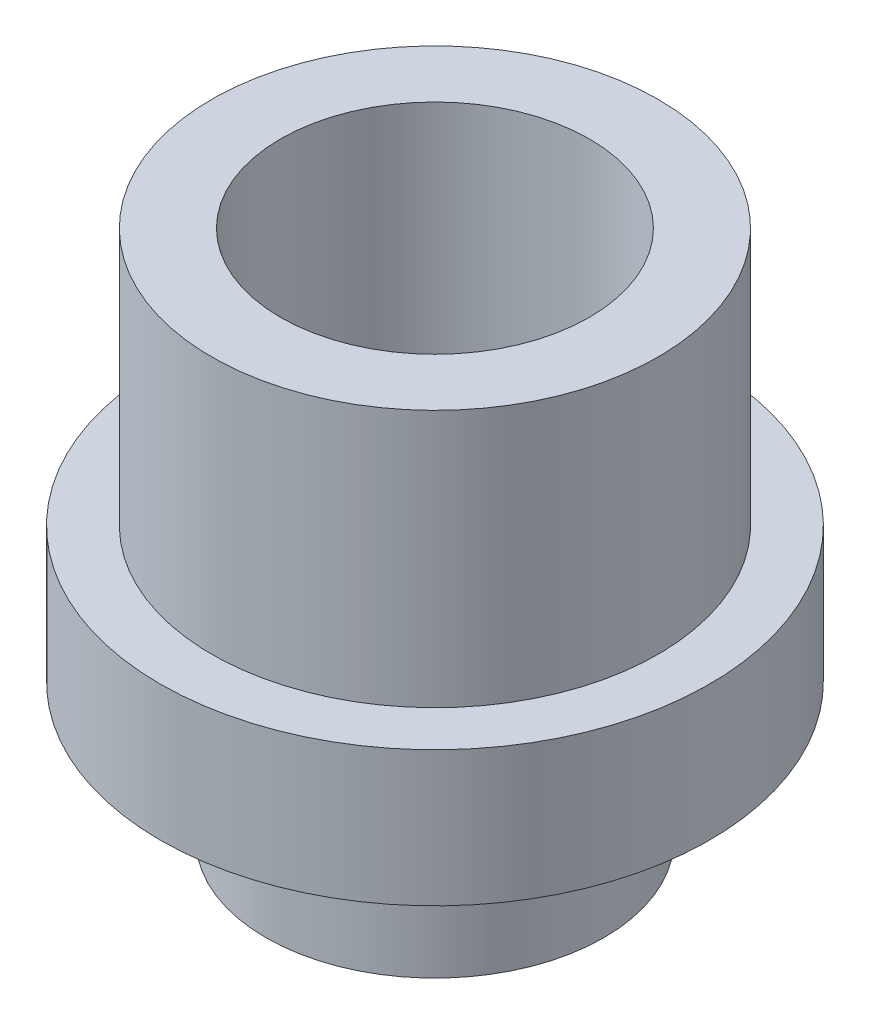
ISO-10303-21;
HEADER;
FILE_DESCRIPTION(('STEP AP214'),'2;1');
FILE_NAME('part.step','',(''),(''),'','','');
FILE_SCHEMA(('AUTOMOTIVE_DESIGN { 1 0 10303 214 1 1 1 1 }'));
ENDSEC;
DATA;
#1=APPLICATION_CONTEXT('core data for automotive mechanical design processes');
#2=APPLICATION_PROTOCOL_DEFINITION('international standard','automotive_design',2000,#1);
#3=PRODUCT_CONTEXT('',#1,'mechanical');
#4=PRODUCT('Part','Part','',(#3));
#5=PRODUCT_RELATED_PRODUCT_CATEGORY('part','',(#4));
#6=PRODUCT_DEFINITION_FORMATION('','',#4);
#7=PRODUCT_DEFINITION_CONTEXT('part definition',#1,'design');
#8=PRODUCT_DEFINITION('design','',#6,#7);
#9=PRODUCT_DEFINITION_SHAPE('','',#8);
#10=(LENGTH_UNIT() NAMED_UNIT(*) SI_UNIT(.MILLI.,.METRE.));
#11=(NAMED_UNIT(*) PLANE_ANGLE_UNIT() SI_UNIT($,.RADIAN.));
#12=(NAMED_UNIT(*) SI_UNIT($,.STERADIAN.) SOLID_ANGLE_UNIT());
#13=UNCERTAINTY_MEASURE_WITH_UNIT(LENGTH_MEASURE(1.E-05),#10,'distance_accuracy_value','');
#14=(GEOMETRIC_REPRESENTATION_CONTEXT(3) GLOBAL_UNCERTAINTY_ASSIGNED_CONTEXT((#13)) GLOBAL_UNIT_ASSIGNED_CONTEXT((#10,
#11,#12)) REPRESENTATION_CONTEXT('',''));
#15=CARTESIAN_POINT('',(0.,0.,0.));
#16=DIRECTION('',(0.,0.,1.));
#17=DIRECTION('',(1.,0.,0.));
#18=AXIS2_PLACEMENT_3D('',#15,#16,#17);
#19=CARTESIAN_POINT('',(0.,0.,0.));
#20=DIRECTION('',(0.,1.,0.));
#21=DIRECTION('',(0.,0.,1.));
#22=AXIS2_PLACEMENT_3D('',#19,#20,#21);
#23=PLANE('',#22);
#24=CARTESIAN_POINT('',(0.,0.,0.));
#25=DIRECTION('',(0.,1.,0.));
#26=DIRECTION('',(0.,0.,1.));
#27=AXIS2_PLACEMENT_3D('',#24,#25,#26);
#28=CIRCLE('',#27,20.32);
#29=CARTESIAN_POINT('',(0.,0.,20.32));
#30=VERTEX_POINT('',#29);
#31=EDGE_CURVE('E47',#30,#30,#28,.T.);
#32=ORIENTED_EDGE('',*,*,#31,.F.);
#33=EDGE_LOOP('',(#32));
#34=FACE_BOUND('',#33,.T.);
#35=CARTESIAN_POINT('',(0.,0.,0.));
#36=DIRECTION('',(0.,1.,0.));
#37=DIRECTION('',(0.,0.,1.));
#38=AXIS2_PLACEMENT_3D('',#35,#36,#37);
#39=CIRCLE('',#38,12.5);
#40=CARTESIAN_POINT('',(0.,0.,12.5));
#41=VERTEX_POINT('',#40);
#42=EDGE_CURVE('E10',#41,#41,#39,.F.);
#43=ORIENTED_EDGE('',*,*,#42,.F.);
#44=EDGE_LOOP('',(#43));
#45=FACE_BOUND('',#44,.T.);
#46=ADVANCED_FACE('F31',(#34,#45),#23,.F.);
#47=CARTESIAN_POINT('',(0.,10.,0.));
#48=DIRECTION('',(0.,1.,0.));
#49=DIRECTION('',(0.,0.,1.));
#50=AXIS2_PLACEMENT_3D('',#47,#48,#49);
#51=PLANE('',#50);
#52=CARTESIAN_POINT('',(0.,10.,0.));
#53=DIRECTION('',(0.,1.,0.));
#54=DIRECTION('',(0.,0.,1.));
#55=AXIS2_PLACEMENT_3D('',#52,#53,#54);
#56=CIRCLE('',#55,4.09575);
#57=CARTESIAN_POINT('',(0.,10.,4.09575));
#58=VERTEX_POINT('',#57);
#59=EDGE_CURVE('E53',#58,#58,#56,.T.);
#60=ORIENTED_EDGE('',*,*,#59,.F.);
#61=EDGE_LOOP('',(#60));
#62=FACE_BOUND('',#61,.T.);
#63=CARTESIAN_POINT('',(0.,10.,0.));
#64=DIRECTION('',(0.,1.,0.));
#65=DIRECTION('',(0.,0.,1.));
#66=AXIS2_PLACEMENT_3D('',#63,#64,#65);
#67=CIRCLE('',#66,11.43);
#68=CARTESIAN_POINT('',(0.,10.,-11.43));
#69=VERTEX_POINT('',#68);
#70=EDGE_CURVE('E105',#69,#69,#67,.T.);
#71=ORIENTED_EDGE('',*,*,#70,.T.);
#72=EDGE_LOOP('',(#71));
#73=FACE_BOUND('',#72,.T.);
#74=ADVANCED_FACE('F61',(#62,#73),#51,.T.);
#75=CARTESIAN_POINT('',(0.,10.,0.));
#76=DIRECTION('',(0.,1.,0.));
#77=DIRECTION('',(0.,0.,1.));
#78=AXIS2_PLACEMENT_3D('',#75,#76,#77);
#79=CIRCLE('',#78,16.51);
#80=CARTESIAN_POINT('',(0.,10.,-16.51));
#81=VERTEX_POINT('',#80);
#82=EDGE_CURVE('E38',#81,#81,#79,.T.);
#83=ORIENTED_EDGE('',*,*,#82,.F.);
#84=EDGE_LOOP('',(#83));
#85=FACE_BOUND('',#84,.T.);
#86=CARTESIAN_POINT('',(0.,10.,0.));
#87=DIRECTION('',(0.,1.,0.));
#88=DIRECTION('',(0.,0.,1.));
#89=AXIS2_PLACEMENT_3D('',#86,#87,#88);
#90=CIRCLE('',#89,20.32);
#91=CARTESIAN_POINT('',(0.,10.,20.32));
#92=VERTEX_POINT('',#91);
#93=EDGE_CURVE('E42',#92,#92,#90,.T.);
#94=ORIENTED_EDGE('',*,*,#93,.T.);
#95=EDGE_LOOP('',(#94));
#96=FACE_BOUND('',#95,.T.);
#97=ADVANCED_FACE('F65',(#85,#96),#51,.T.);
#98=CARTESIAN_POINT('',(0.,10.,0.));
#99=DIRECTION('',(0.,-1.,0.));
#100=DIRECTION('',(0.,0.,-1.));
#101=AXIS2_PLACEMENT_3D('',#98,#99,#100);
#102=CYLINDRICAL_SURFACE('',#101,20.32);
#103=ORIENTED_EDGE('',*,*,#93,.F.);
#104=EDGE_LOOP('',(#103));
#105=FACE_BOUND('',#104,.T.);
#106=ORIENTED_EDGE('',*,*,#31,.T.);
#107=EDGE_LOOP('',(#106));
#108=FACE_BOUND('',#107,.T.);
#109=ADVANCED_FACE('F33',(#105,#108),#102,.T.);
#110=CARTESIAN_POINT('',(0.,10.,0.));
#111=DIRECTION('',(0.,-1.,0.));
#112=DIRECTION('',(0.,0.,-1.));
#113=AXIS2_PLACEMENT_3D('',#110,#111,#112);
#114=CYLINDRICAL_SURFACE('',#113,4.09575);
#115=ORIENTED_EDGE('',*,*,#59,.T.);
#116=EDGE_LOOP('',(#115));
#117=FACE_BOUND('',#116,.T.);
#118=CARTESIAN_POINT('',(0.,-10.16,0.));
#119=DIRECTION('',(0.,-1.,0.));
#120=DIRECTION('',(0.,0.,-1.));
#121=AXIS2_PLACEMENT_3D('',#118,#119,#120);
#122=CIRCLE('',#121,4.09575);
#123=CARTESIAN_POINT('',(0.,-10.16,-4.09575));
#124=VERTEX_POINT('',#123);
#125=EDGE_CURVE('E102',#124,#124,#122,.T.);
#126=ORIENTED_EDGE('',*,*,#125,.T.);
#127=EDGE_LOOP('',(#126));
#128=FACE_BOUND('',#127,.T.);
#129=ADVANCED_FACE('F71',(#117,#128),#114,.F.);
#130=CARTESIAN_POINT('',(0.,29.05,0.));
#131=DIRECTION('',(0.,1.,0.));
#132=DIRECTION('',(0.,0.,1.));
#133=AXIS2_PLACEMENT_3D('',#130,#131,#132);
#134=PLANE('',#133);
#135=CARTESIAN_POINT('',(0.,29.05,0.));
#136=DIRECTION('',(0.,1.,0.));
#137=DIRECTION('',(0.,0.,1.));
#138=AXIS2_PLACEMENT_3D('',#135,#136,#137);
#139=CIRCLE('',#138,16.51);
#140=CARTESIAN_POINT('',(0.,29.05,-16.51));
#141=VERTEX_POINT('',#140);
#142=EDGE_CURVE('E51',#141,#141,#139,.T.);
#143=ORIENTED_EDGE('',*,*,#142,.T.);
#144=EDGE_LOOP('',(#143));
#145=FACE_BOUND('',#144,.T.);
#146=CARTESIAN_POINT('',(0.,29.05,0.));
#147=DIRECTION('',(0.,1.,0.));
#148=DIRECTION('',(0.,0.,1.));
#149=AXIS2_PLACEMENT_3D('',#146,#147,#148);
#150=CIRCLE('',#149,11.43);
#151=CARTESIAN_POINT('',(0.,29.05,-11.43));
#152=VERTEX_POINT('',#151);
#153=EDGE_CURVE('E108',#152,#152,#150,.T.);
#154=ORIENTED_EDGE('',*,*,#153,.F.);
#155=EDGE_LOOP('',(#154));
#156=FACE_BOUND('',#155,.T.);
#157=ADVANCED_FACE('F74',(#145,#156),#134,.T.);
#158=CARTESIAN_POINT('',(0.,29.05,0.));
#159=DIRECTION('',(0.,-1.,0.));
#160=DIRECTION('',(0.,0.,-1.));
#161=AXIS2_PLACEMENT_3D('',#158,#159,#160);
#162=CYLINDRICAL_SURFACE('',#161,16.51);
#163=CARTESIAN_POINT('',(0.,29.05,-16.51));
#164=CARTESIAN_POINT('',(0.,28.8515625,-16.51));
#165=CARTESIAN_POINT('',(0.,28.653125,-16.51));
#166=CARTESIAN_POINT('',(0.,28.25625,-16.51));
#167=CARTESIAN_POINT('',(0.,28.0578125,-16.51));
#168=CARTESIAN_POINT('',(0.,27.6609375,-16.51));
#169=CARTESIAN_POINT('',(0.,27.4625,-16.51));
#170=CARTESIAN_POINT('',(0.,27.065625,-16.51));
#171=CARTESIAN_POINT('',(0.,26.8671875,-16.51));
#172=CARTESIAN_POINT('',(0.,26.4703125,-16.51));
#173=CARTESIAN_POINT('',(0.,26.271875,-16.51));
#174=CARTESIAN_POINT('',(0.,25.875,-16.51));
#175=CARTESIAN_POINT('',(0.,25.6765625,-16.51));
#176=CARTESIAN_POINT('',(0.,25.2796875,-16.51));
#177=CARTESIAN_POINT('',(0.,25.08125,-16.51));
#178=CARTESIAN_POINT('',(0.,24.684375,-16.51));
#179=CARTESIAN_POINT('',(0.,24.4859375,-16.51));
#180=CARTESIAN_POINT('',(0.,24.0890625,-16.51));
#181=CARTESIAN_POINT('',(0.,23.890625,-16.51));
#182=CARTESIAN_POINT('',(0.,23.49375,-16.51));
#183=CARTESIAN_POINT('',(0.,23.2953125,-16.51));
#184=CARTESIAN_POINT('',(0.,22.8984375,-16.51));
#185=CARTESIAN_POINT('',(0.,22.7,-16.51));
#186=CARTESIAN_POINT('',(0.,22.303125,-16.51));
#187=CARTESIAN_POINT('',(0.,22.1046875,-16.51));
#188=CARTESIAN_POINT('',(0.,21.7078125,-16.51));
#189=CARTESIAN_POINT('',(0.,21.509375,-16.51));
#190=CARTESIAN_POINT('',(0.,21.1125,-16.51));
#191=CARTESIAN_POINT('',(0.,20.9140625,-16.51));
#192=CARTESIAN_POINT('',(0.,20.5171875,-16.51));
#193=CARTESIAN_POINT('',(0.,20.31875,-16.51));
#194=CARTESIAN_POINT('',(0.,19.921875,-16.51));
#195=CARTESIAN_POINT('',(0.,19.7234375,-16.51));
#196=CARTESIAN_POINT('',(0.,19.3265625,-16.51));
#197=CARTESIAN_POINT('',(0.,19.128125,-16.51));
#198=CARTESIAN_POINT('',(0.,18.73125,-16.51));
#199=CARTESIAN_POINT('',(0.,18.5328125,-16.51));
#200=CARTESIAN_POINT('',(0.,18.1359375,-16.51));
#201=CARTESIAN_POINT('',(0.,17.9375,-16.51));
#202=CARTESIAN_POINT('',(0.,17.540625,-16.51));
#203=CARTESIAN_POINT('',(0.,17.3421875,-16.51));
#204=CARTESIAN_POINT('',(0.,16.9453125,-16.51));
#205=CARTESIAN_POINT('',(0.,16.746875,-16.51));
#206=CARTESIAN_POINT('',(0.,16.35,-16.51));
#207=CARTESIAN_POINT('',(0.,16.1515625,-16.51));
#208=CARTESIAN_POINT('',(0.,15.7546875,-16.51));
#209=CARTESIAN_POINT('',(0.,15.55625,-16.51));
#210=CARTESIAN_POINT('',(0.,15.159375,-16.51));
#211=CARTESIAN_POINT('',(0.,14.9609375,-16.51));
#212=CARTESIAN_POINT('',(0.,14.5640625,-16.51));
#213=CARTESIAN_POINT('',(0.,14.365625,-16.51));
#214=CARTESIAN_POINT('',(0.,13.96875,-16.51));
#215=CARTESIAN_POINT('',(0.,13.7703125,-16.51));
#216=CARTESIAN_POINT('',(0.,13.3734375,-16.51));
#217=CARTESIAN_POINT('',(0.,13.175,-16.51));
#218=CARTESIAN_POINT('',(0.,12.778125,-16.51));
#219=CARTESIAN_POINT('',(0.,12.5796875,-16.51));
#220=CARTESIAN_POINT('',(0.,12.1828125,-16.51));
#221=CARTESIAN_POINT('',(0.,11.984375,-16.51));
#222=CARTESIAN_POINT('',(0.,11.5875,-16.51));
#223=CARTESIAN_POINT('',(0.,11.3890625,-16.51));
#224=CARTESIAN_POINT('',(0.,10.9921875,-16.51));
#225=CARTESIAN_POINT('',(0.,10.79375,-16.51));
#226=CARTESIAN_POINT('',(0.,10.396875,-16.51));
#227=CARTESIAN_POINT('',(0.,10.1984375,-16.51));
#228=CARTESIAN_POINT('',(0.,10.,-16.51));
#229=B_SPLINE_CURVE_WITH_KNOTS('',3,(#163,#164,#165,#166,#167,#168,#169,#170,#171,#172,#173,
#174,#175,#176,#177,#178,#179,#180,#181,#182,#183,#184,#185,#186,#187,#188,#189,#190,#191,#192,
#193,#194,#195,#196,#197,#198,#199,#200,#201,#202,#203,#204,#205,#206,#207,#208,#209,#210,#211,
#212,#213,#214,#215,#216,#217,#218,#219,#220,#221,#222,#223,#224,#225,#226,#227,#228),
.UNSPECIFIED.,.F.,.F.,(4,2,2,2,2,2,2,2,2,2,2,2,2,2,2,2,2,2,2,2,2,2,2,2,2,2,2,2,2,2,2,2,4),(0.,
0.595312499999997,1.190625,1.7859375,2.38125,2.9765625,3.571875,4.1671875,4.7625,5.3578125,
5.953125,6.5484375,7.14375,7.7390625,8.33437499999999,8.92968749999999,9.525,10.1203125,
10.715625,11.3109375,11.90625,12.5015625,13.096875,13.6921875,14.2875,14.8828125,15.478125,
16.0734375,16.66875,17.2640625,17.859375,18.4546875,19.05),.UNSPECIFIED.);
#230=EDGE_CURVE('BSEAM76',#141,#81,#229,.T.);
#231=ORIENTED_EDGE('',*,*,#142,.F.);
#232=ORIENTED_EDGE('',*,*,#82,.T.);
#233=ORIENTED_EDGE('',*,*,#230,.T.);
#234=ORIENTED_EDGE('',*,*,#230,.F.);
#235=EDGE_LOOP('',(#231,#233,#232,#234));
#236=FACE_BOUND('',#235,.T.);
#237=ADVANCED_FACE('F76',(#236),#162,.T.);
#238=CARTESIAN_POINT('',(0.,29.05,0.));
#239=DIRECTION('',(0.,-1.,0.));
#240=DIRECTION('',(0.,0.,-1.));
#241=AXIS2_PLACEMENT_3D('',#238,#239,#240);
#242=CYLINDRICAL_SURFACE('',#241,11.43);
#243=CARTESIAN_POINT('',(0.,29.05,-11.43));
#244=CARTESIAN_POINT('',(0.,28.8515625,-11.43));
#245=CARTESIAN_POINT('',(0.,28.653125,-11.43));
#246=CARTESIAN_POINT('',(0.,28.25625,-11.43));
#247=CARTESIAN_POINT('',(0.,28.0578125,-11.43));
#248=CARTESIAN_POINT('',(0.,27.6609375,-11.43));
#249=CARTESIAN_POINT('',(0.,27.4625,-11.43));
#250=CARTESIAN_POINT('',(0.,27.065625,-11.43));
#251=CARTESIAN_POINT('',(0.,26.8671875,-11.43));
#252=CARTESIAN_POINT('',(0.,26.4703125,-11.43));
#253=CARTESIAN_POINT('',(0.,26.271875,-11.43));
#254=CARTESIAN_POINT('',(0.,25.875,-11.43));
#255=CARTESIAN_POINT('',(0.,25.6765625,-11.43));
#256=CARTESIAN_POINT('',(0.,25.2796875,-11.43));
#257=CARTESIAN_POINT('',(0.,25.08125,-11.43));
#258=CARTESIAN_POINT('',(0.,24.684375,-11.43));
#259=CARTESIAN_POINT('',(0.,24.4859375,-11.43));
#260=CARTESIAN_POINT('',(0.,24.0890625,-11.43));
#261=CARTESIAN_POINT('',(0.,23.890625,-11.43));
#262=CARTESIAN_POINT('',(0.,23.49375,-11.43));
#263=CARTESIAN_POINT('',(0.,23.2953125,-11.43));
#264=CARTESIAN_POINT('',(0.,22.8984375,-11.43));
#265=CARTESIAN_POINT('',(0.,22.7,-11.43));
#266=CARTESIAN_POINT('',(0.,22.303125,-11.43));
#267=CARTESIAN_POINT('',(0.,22.1046875,-11.43));
#268=CARTESIAN_POINT('',(0.,21.7078125,-11.43));
#269=CARTESIAN_POINT('',(0.,21.509375,-11.43));
#270=CARTESIAN_POINT('',(0.,21.1125,-11.43));
#271=CARTESIAN_POINT('',(0.,20.9140625,-11.43));
#272=CARTESIAN_POINT('',(0.,20.5171875,-11.43));
#273=CARTESIAN_POINT('',(0.,20.31875,-11.43));
#274=CARTESIAN_POINT('',(0.,19.921875,-11.43));
#275=CARTESIAN_POINT('',(0.,19.7234375,-11.43));
#276=CARTESIAN_POINT('',(0.,19.3265625,-11.43));
#277=CARTESIAN_POINT('',(0.,19.128125,-11.43));
#278=CARTESIAN_POINT('',(0.,18.73125,-11.43));
#279=CARTESIAN_POINT('',(0.,18.5328125,-11.43));
#280=CARTESIAN_POINT('',(0.,18.1359375,-11.43));
#281=CARTESIAN_POINT('',(0.,17.9375,-11.43));
#282=CARTESIAN_POINT('',(0.,17.540625,-11.43));
#283=CARTESIAN_POINT('',(0.,17.3421875,-11.43));
#284=CARTESIAN_POINT('',(0.,16.9453125,-11.43));
#285=CARTESIAN_POINT('',(0.,16.746875,-11.43));
#286=CARTESIAN_POINT('',(0.,16.35,-11.43));
#287=CARTESIAN_POINT('',(0.,16.1515625,-11.43));
#288=CARTESIAN_POINT('',(0.,15.7546875,-11.43));
#289=CARTESIAN_POINT('',(0.,15.55625,-11.43));
#290=CARTESIAN_POINT('',(0.,15.159375,-11.43));
#291=CARTESIAN_POINT('',(0.,14.9609375,-11.43));
#292=CARTESIAN_POINT('',(0.,14.5640625,-11.43));
#293=CARTESIAN_POINT('',(0.,14.365625,-11.43));
#294=CARTESIAN_POINT('',(0.,13.96875,-11.43));
#295=CARTESIAN_POINT('',(0.,13.7703125,-11.43));
#296=CARTESIAN_POINT('',(0.,13.3734375,-11.43));
#297=CARTESIAN_POINT('',(0.,13.175,-11.43));
#298=CARTESIAN_POINT('',(0.,12.778125,-11.43));
#299=CARTESIAN_POINT('',(0.,12.5796875,-11.43));
#300=CARTESIAN_POINT('',(0.,12.1828125,-11.43));
#301=CARTESIAN_POINT('',(0.,11.984375,-11.43));
#302=CARTESIAN_POINT('',(0.,11.5875,-11.43));
#303=CARTESIAN_POINT('',(0.,11.3890625,-11.43));
#304=CARTESIAN_POINT('',(0.,10.9921875,-11.43));
#305=CARTESIAN_POINT('',(0.,10.79375,-11.43));
#306=CARTESIAN_POINT('',(0.,10.396875,-11.43));
#307=CARTESIAN_POINT('',(0.,10.1984375,-11.43));
#308=CARTESIAN_POINT('',(0.,10.,-11.43));
#309=B_SPLINE_CURVE_WITH_KNOTS('',3,(#243,#244,#245,#246,#247,#248,#249,#250,#251,#252,#253,
#254,#255,#256,#257,#258,#259,#260,#261,#262,#263,#264,#265,#266,#267,#268,#269,#270,#271,#272,
#273,#274,#275,#276,#277,#278,#279,#280,#281,#282,#283,#284,#285,#286,#287,#288,#289,#290,#291,
#292,#293,#294,#295,#296,#297,#298,#299,#300,#301,#302,#303,#304,#305,#306,#307,#308),
.UNSPECIFIED.,.F.,.F.,(4,2,2,2,2,2,2,2,2,2,2,2,2,2,2,2,2,2,2,2,2,2,2,2,2,2,2,2,2,2,2,2,4),(0.,
0.595312499999997,1.190625,1.7859375,2.38125,2.9765625,3.571875,4.1671875,4.7625,5.3578125,
5.953125,6.5484375,7.14375,7.7390625,8.33437499999999,8.92968749999999,9.525,10.1203125,
10.715625,11.3109375,11.90625,12.5015625,13.096875,13.6921875,14.2875,14.8828125,15.478125,
16.0734375,16.66875,17.2640625,17.859375,18.4546875,19.05),.UNSPECIFIED.);
#310=EDGE_CURVE('BSEAM79',#152,#69,#309,.T.);
#311=ORIENTED_EDGE('',*,*,#153,.T.);
#312=ORIENTED_EDGE('',*,*,#70,.F.);
#313=ORIENTED_EDGE('',*,*,#310,.T.);
#314=ORIENTED_EDGE('',*,*,#310,.F.);
#315=EDGE_LOOP('',(#311,#313,#312,#314));
#316=FACE_BOUND('',#315,.T.);
#317=ADVANCED_FACE('F79',(#316),#242,.F.);
#318=CARTESIAN_POINT('',(0.,-10.16,0.));
#319=DIRECTION('',(0.,-1.,0.));
#320=DIRECTION('',(0.,0.,-1.));
#321=AXIS2_PLACEMENT_3D('',#318,#319,#320);
#322=PLANE('',#321);
#323=CARTESIAN_POINT('',(0.,-10.16,0.));
#324=DIRECTION('',(0.,-1.,0.));
#325=DIRECTION('',(0.,0.,-1.));
#326=AXIS2_PLACEMENT_3D('',#323,#324,#325);
#327=CIRCLE('',#326,12.5);
#328=CARTESIAN_POINT('',(0.,-10.16,-12.5));
#329=VERTEX_POINT('',#328);
#330=EDGE_CURVE('E99',#329,#329,#327,.T.);
#331=ORIENTED_EDGE('',*,*,#330,.T.);
#332=EDGE_LOOP('',(#331));
#333=FACE_BOUND('',#332,.T.);
#334=ORIENTED_EDGE('',*,*,#125,.F.);
#335=EDGE_LOOP('',(#334));
#336=FACE_BOUND('',#335,.T.);
#337=ADVANCED_FACE('F86',(#333,#336),#322,.T.);
#338=CARTESIAN_POINT('',(0.,-10.16,0.));
#339=DIRECTION('',(0.,1.,0.));
#340=DIRECTION('',(0.,0.,1.));
#341=AXIS2_PLACEMENT_3D('',#338,#339,#340);
#342=CYLINDRICAL_SURFACE('',#341,12.5);
#343=ORIENTED_EDGE('',*,*,#330,.F.);
#344=EDGE_LOOP('',(#343));
#345=FACE_BOUND('',#344,.T.);
#346=ORIENTED_EDGE('',*,*,#42,.T.);
#347=EDGE_LOOP('',(#346));
#348=FACE_BOUND('',#347,.T.);
#349=ADVANCED_FACE('F88',(#345,#348),#342,.T.);
#350=CLOSED_SHELL('',(#46,#74,#97,#109,#129,#157,#237,#317,#337,#349));
#351=MANIFOLD_SOLID_BREP('B2',#350);
#352=ADVANCED_BREP_SHAPE_REPRESENTATION('',(#18,#351),#14);
#353=SHAPE_DEFINITION_REPRESENTATION(#9,#352);
ENDSEC;
END-ISO-10303-21;
